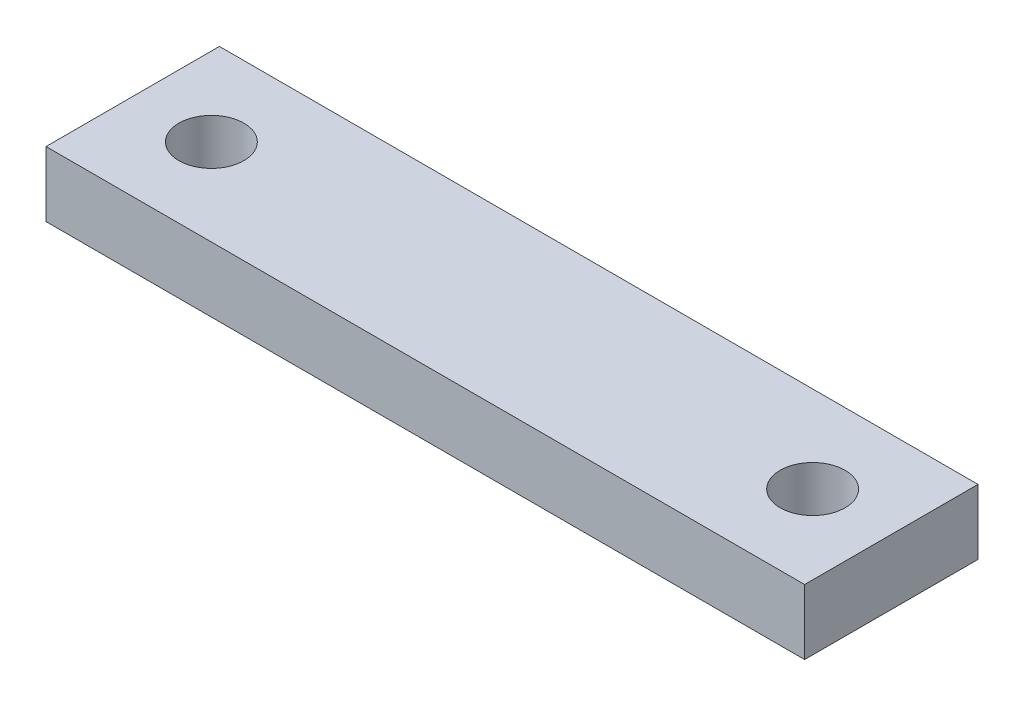
ISO-10303-21;
HEADER;
FILE_DESCRIPTION(('STEP AP214'),'2;1');
FILE_NAME('part.step','',(''),(''),'','','');
FILE_SCHEMA(('AUTOMOTIVE_DESIGN { 1 0 10303 214 1 1 1 1 }'));
ENDSEC;
DATA;
#1=APPLICATION_CONTEXT('core data for automotive mechanical design processes');
#2=APPLICATION_PROTOCOL_DEFINITION('international standard','automotive_design',2000,#1);
#3=PRODUCT_CONTEXT('',#1,'mechanical');
#4=PRODUCT('Part','Part','',(#3));
#5=PRODUCT_RELATED_PRODUCT_CATEGORY('part','',(#4));
#6=PRODUCT_DEFINITION_FORMATION('','',#4);
#7=PRODUCT_DEFINITION_CONTEXT('part definition',#1,'design');
#8=PRODUCT_DEFINITION('design','',#6,#7);
#9=PRODUCT_DEFINITION_SHAPE('','',#8);
#10=(LENGTH_UNIT() NAMED_UNIT(*) SI_UNIT(.MILLI.,.METRE.));
#11=(NAMED_UNIT(*) PLANE_ANGLE_UNIT() SI_UNIT($,.RADIAN.));
#12=(NAMED_UNIT(*) SI_UNIT($,.STERADIAN.) SOLID_ANGLE_UNIT());
#13=UNCERTAINTY_MEASURE_WITH_UNIT(LENGTH_MEASURE(1.E-05),#10,'distance_accuracy_value','');
#14=(GEOMETRIC_REPRESENTATION_CONTEXT(3) GLOBAL_UNCERTAINTY_ASSIGNED_CONTEXT((#13)) GLOBAL_UNIT_ASSIGNED_CONTEXT((#10,
#11,#12)) REPRESENTATION_CONTEXT('',''));
#15=CARTESIAN_POINT('',(0.,0.,0.));
#16=DIRECTION('',(0.,0.,1.));
#17=DIRECTION('',(1.,0.,0.));
#18=AXIS2_PLACEMENT_3D('',#15,#16,#17);
#19=CARTESIAN_POINT('',(0.,3.,0.));
#20=DIRECTION('',(0.,-1.,0.));
#21=DIRECTION('',(0.,0.,-1.));
#22=AXIS2_PLACEMENT_3D('',#19,#20,#21);
#23=PLANE('',#22);
#24=DIRECTION('',(0.,0.,-1.));
#25=VECTOR('',#24,1.);
#26=CARTESIAN_POINT('',(17.5,3.,4.));
#27=LINE('',#26,#25);
#28=CARTESIAN_POINT('',(17.5,3.,4.));
#29=VERTEX_POINT('',#28);
#30=CARTESIAN_POINT('',(17.5,3.,-4.));
#31=VERTEX_POINT('',#30);
#32=EDGE_CURVE('E88',#29,#31,#27,.T.);
#33=ORIENTED_EDGE('',*,*,#32,.T.);
#34=DIRECTION('',(-1.,0.,0.));
#35=VECTOR('',#34,1.);
#36=CARTESIAN_POINT('',(-17.5,3.,-4.));
#37=LINE('',#36,#35);
#38=CARTESIAN_POINT('',(-17.5,3.,-4.));
#39=VERTEX_POINT('',#38);
#40=EDGE_CURVE('E83',#31,#39,#37,.T.);
#41=ORIENTED_EDGE('',*,*,#40,.T.);
#42=DIRECTION('',(0.,0.,1.));
#43=VECTOR('',#42,1.);
#44=CARTESIAN_POINT('',(-17.5,3.,4.));
#45=LINE('',#44,#43);
#46=CARTESIAN_POINT('',(-17.5,3.,4.));
#47=VERTEX_POINT('',#46);
#48=EDGE_CURVE('E86',#39,#47,#45,.T.);
#49=ORIENTED_EDGE('',*,*,#48,.T.);
#50=DIRECTION('',(1.,0.,0.));
#51=VECTOR('',#50,1.);
#52=CARTESIAN_POINT('',(-17.5,3.,4.));
#53=LINE('',#52,#51);
#54=EDGE_CURVE('E53',#47,#29,#53,.T.);
#55=ORIENTED_EDGE('',*,*,#54,.T.);
#56=EDGE_LOOP('',(#33,#41,#49,#55));
#57=FACE_BOUND('',#56,.T.);
#58=CARTESIAN_POINT('',(-13.87,3.,0.));
#59=DIRECTION('',(0.,1.,0.));
#60=DIRECTION('',(0.,0.,1.));
#61=AXIS2_PLACEMENT_3D('',#58,#59,#60);
#62=CIRCLE('',#61,1.5);
#63=CARTESIAN_POINT('',(-13.87,3.,1.5));
#64=VERTEX_POINT('',#63);
#65=EDGE_CURVE('E103',#64,#64,#62,.T.);
#66=ORIENTED_EDGE('',*,*,#65,.F.);
#67=EDGE_LOOP('',(#66));
#68=FACE_BOUND('',#67,.T.);
#69=CARTESIAN_POINT('',(13.87,3.,0.));
#70=DIRECTION('',(0.,1.,0.));
#71=DIRECTION('',(0.,0.,-1.));
#72=AXIS2_PLACEMENT_3D('',#69,#70,#71);
#73=CIRCLE('',#72,1.5);
#74=CARTESIAN_POINT('',(13.87,3.,-1.5));
#75=VERTEX_POINT('',#74);
#76=EDGE_CURVE('E118',#75,#75,#73,.T.);
#77=ORIENTED_EDGE('',*,*,#76,.F.);
#78=EDGE_LOOP('',(#77));
#79=FACE_BOUND('',#78,.T.);
#80=ADVANCED_FACE('F36',(#57,#68,#79),#23,.F.);
#81=CARTESIAN_POINT('',(0.,0.,0.));
#82=DIRECTION('',(0.,-1.,0.));
#83=DIRECTION('',(0.,0.,-1.));
#84=AXIS2_PLACEMENT_3D('',#81,#82,#83);
#85=PLANE('',#84);
#86=CARTESIAN_POINT('',(-13.87,0.,0.));
#87=DIRECTION('',(0.,1.,0.));
#88=DIRECTION('',(0.,0.,1.));
#89=AXIS2_PLACEMENT_3D('',#86,#87,#88);
#90=CIRCLE('',#89,1.5);
#91=CARTESIAN_POINT('',(-13.87,0.,1.5));
#92=VERTEX_POINT('',#91);
#93=EDGE_CURVE('E115',#92,#92,#90,.T.);
#94=ORIENTED_EDGE('',*,*,#93,.T.);
#95=EDGE_LOOP('',(#94));
#96=FACE_BOUND('',#95,.T.);
#97=DIRECTION('',(0.,0.,-1.));
#98=VECTOR('',#97,1.);
#99=CARTESIAN_POINT('',(17.5,0.,4.));
#100=LINE('',#99,#98);
#101=CARTESIAN_POINT('',(17.5,0.,4.));
#102=VERTEX_POINT('',#101);
#103=CARTESIAN_POINT('',(17.5,0.,-4.));
#104=VERTEX_POINT('',#103);
#105=EDGE_CURVE('E100',#102,#104,#100,.T.);
#106=ORIENTED_EDGE('',*,*,#105,.F.);
#107=DIRECTION('',(1.,0.,0.));
#108=VECTOR('',#107,1.);
#109=CARTESIAN_POINT('',(-17.5,0.,4.));
#110=LINE('',#109,#108);
#111=CARTESIAN_POINT('',(-17.5,0.,4.));
#112=VERTEX_POINT('',#111);
#113=EDGE_CURVE('E76',#112,#102,#110,.T.);
#114=ORIENTED_EDGE('',*,*,#113,.F.);
#115=DIRECTION('',(0.,0.,1.));
#116=VECTOR('',#115,1.);
#117=CARTESIAN_POINT('',(-17.5,0.,4.));
#118=LINE('',#117,#116);
#119=CARTESIAN_POINT('',(-17.5,0.,-4.));
#120=VERTEX_POINT('',#119);
#121=EDGE_CURVE('E70',#120,#112,#118,.T.);
#122=ORIENTED_EDGE('',*,*,#121,.F.);
#123=DIRECTION('',(-1.,0.,0.));
#124=VECTOR('',#123,1.);
#125=CARTESIAN_POINT('',(-17.5,0.,-4.));
#126=LINE('',#125,#124);
#127=EDGE_CURVE('E92',#104,#120,#126,.T.);
#128=ORIENTED_EDGE('',*,*,#127,.F.);
#129=EDGE_LOOP('',(#106,#114,#122,#128));
#130=FACE_BOUND('',#129,.T.);
#131=CARTESIAN_POINT('',(13.87,0.,0.));
#132=DIRECTION('',(0.,1.,0.));
#133=DIRECTION('',(0.,0.,-1.));
#134=AXIS2_PLACEMENT_3D('',#131,#132,#133);
#135=CIRCLE('',#134,1.5);
#136=CARTESIAN_POINT('',(13.87,0.,-1.5));
#137=VERTEX_POINT('',#136);
#138=EDGE_CURVE('E121',#137,#137,#135,.T.);
#139=ORIENTED_EDGE('',*,*,#138,.T.);
#140=EDGE_LOOP('',(#139));
#141=FACE_BOUND('',#140,.T.);
#142=ADVANCED_FACE('F111',(#96,#130,#141),#85,.T.);
#143=CARTESIAN_POINT('',(17.5,3.,4.));
#144=DIRECTION('',(-1.,0.,0.));
#145=DIRECTION('',(0.,0.,1.));
#146=AXIS2_PLACEMENT_3D('',#143,#144,#145);
#147=PLANE('',#146);
#148=ORIENTED_EDGE('',*,*,#105,.T.);
#149=DIRECTION('',(0.,-1.,0.));
#150=VECTOR('',#149,1.);
#151=CARTESIAN_POINT('',(17.5,3.,-4.));
#152=LINE('',#151,#150);
#153=EDGE_CURVE('E11',#31,#104,#152,.T.);
#154=ORIENTED_EDGE('',*,*,#153,.F.);
#155=ORIENTED_EDGE('',*,*,#32,.F.);
#156=DIRECTION('',(0.,-1.,0.));
#157=VECTOR('',#156,1.);
#158=CARTESIAN_POINT('',(17.5,3.,4.));
#159=LINE('',#158,#157);
#160=EDGE_CURVE('E96',#29,#102,#159,.T.);
#161=ORIENTED_EDGE('',*,*,#160,.T.);
#162=EDGE_LOOP('',(#148,#154,#155,#161));
#163=FACE_BOUND('',#162,.T.);
#164=ADVANCED_FACE('F38',(#163),#147,.F.);
#165=CARTESIAN_POINT('',(-17.5,3.,-4.));
#166=DIRECTION('',(0.,0.,1.));
#167=DIRECTION('',(1.,0.,0.));
#168=AXIS2_PLACEMENT_3D('',#165,#166,#167);
#169=PLANE('',#168);
#170=ORIENTED_EDGE('',*,*,#127,.T.);
#171=DIRECTION('',(0.,-1.,0.));
#172=VECTOR('',#171,1.);
#173=CARTESIAN_POINT('',(-17.5,3.,-4.));
#174=LINE('',#173,#172);
#175=EDGE_CURVE('E45',#39,#120,#174,.T.);
#176=ORIENTED_EDGE('',*,*,#175,.F.);
#177=ORIENTED_EDGE('',*,*,#40,.F.);
#178=ORIENTED_EDGE('',*,*,#153,.T.);
#179=EDGE_LOOP('',(#170,#176,#177,#178));
#180=FACE_BOUND('',#179,.T.);
#181=ADVANCED_FACE('F91',(#180),#169,.F.);
#182=CARTESIAN_POINT('',(-17.5,3.,4.));
#183=DIRECTION('',(1.,0.,0.));
#184=DIRECTION('',(0.,0.,-1.));
#185=AXIS2_PLACEMENT_3D('',#182,#183,#184);
#186=PLANE('',#185);
#187=ORIENTED_EDGE('',*,*,#121,.T.);
#188=DIRECTION('',(0.,-1.,0.));
#189=VECTOR('',#188,1.);
#190=CARTESIAN_POINT('',(-17.5,3.,4.));
#191=LINE('',#190,#189);
#192=EDGE_CURVE('E93',#47,#112,#191,.T.);
#193=ORIENTED_EDGE('',*,*,#192,.F.);
#194=ORIENTED_EDGE('',*,*,#48,.F.);
#195=ORIENTED_EDGE('',*,*,#175,.T.);
#196=EDGE_LOOP('',(#187,#193,#194,#195));
#197=FACE_BOUND('',#196,.T.);
#198=ADVANCED_FACE('F94',(#197),#186,.F.);
#199=CARTESIAN_POINT('',(-17.5,3.,4.));
#200=DIRECTION('',(0.,0.,-1.));
#201=DIRECTION('',(-1.,0.,0.));
#202=AXIS2_PLACEMENT_3D('',#199,#200,#201);
#203=PLANE('',#202);
#204=ORIENTED_EDGE('',*,*,#113,.T.);
#205=ORIENTED_EDGE('',*,*,#160,.F.);
#206=ORIENTED_EDGE('',*,*,#54,.F.);
#207=ORIENTED_EDGE('',*,*,#192,.T.);
#208=EDGE_LOOP('',(#204,#205,#206,#207));
#209=FACE_BOUND('',#208,.T.);
#210=ADVANCED_FACE('F108',(#209),#203,.F.);
#211=CARTESIAN_POINT('',(-13.87,3.,0.));
#212=DIRECTION('',(0.,-1.,0.));
#213=DIRECTION('',(0.,0.,-1.));
#214=AXIS2_PLACEMENT_3D('',#211,#212,#213);
#215=CYLINDRICAL_SURFACE('',#214,1.5);
#216=ORIENTED_EDGE('',*,*,#65,.T.);
#217=EDGE_LOOP('',(#216));
#218=FACE_BOUND('',#217,.T.);
#219=ORIENTED_EDGE('',*,*,#93,.F.);
#220=EDGE_LOOP('',(#219));
#221=FACE_BOUND('',#220,.T.);
#222=ADVANCED_FACE('F138',(#218,#221),#215,.F.);
#223=CARTESIAN_POINT('',(13.87,3.,0.));
#224=DIRECTION('',(0.,-1.,0.));
#225=DIRECTION('',(0.,0.,-1.));
#226=AXIS2_PLACEMENT_3D('',#223,#224,#225);
#227=CYLINDRICAL_SURFACE('',#226,1.5);
#228=ORIENTED_EDGE('',*,*,#76,.T.);
#229=EDGE_LOOP('',(#228));
#230=FACE_BOUND('',#229,.T.);
#231=ORIENTED_EDGE('',*,*,#138,.F.);
#232=EDGE_LOOP('',(#231));
#233=FACE_BOUND('',#232,.T.);
#234=ADVANCED_FACE('F127',(#230,#233),#227,.F.);
#235=CLOSED_SHELL('',(#80,#142,#164,#181,#198,#210,#222,#234));
#236=MANIFOLD_SOLID_BREP('B2',#235);
#237=ADVANCED_BREP_SHAPE_REPRESENTATION('',(#18,#236),#14);
#238=SHAPE_DEFINITION_REPRESENTATION(#9,#237);
ENDSEC;
END-ISO-10303-21;
